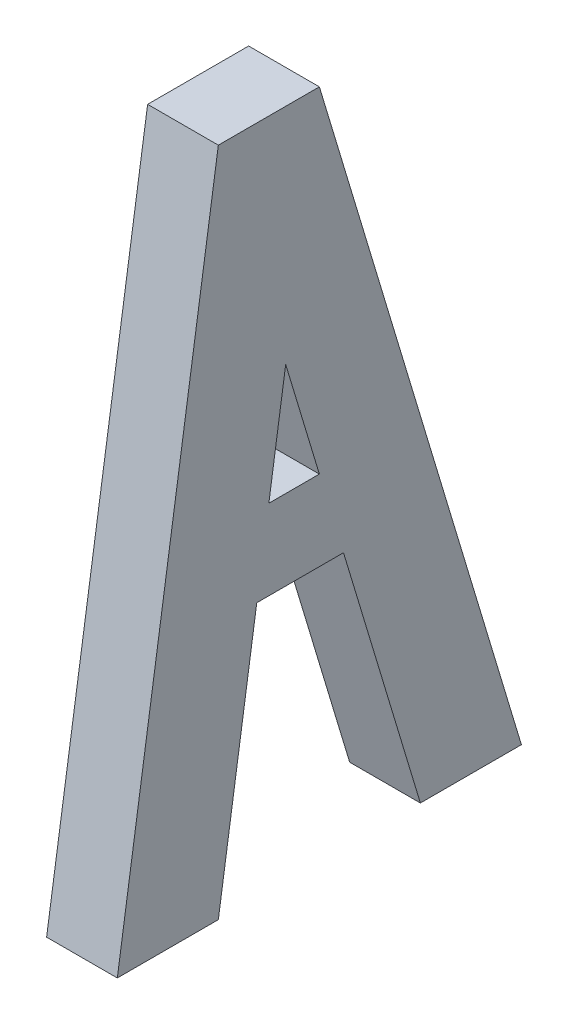
ISO-10303-21;
HEADER;
FILE_DESCRIPTION(('STEP AP214'),'2;1');
FILE_NAME('part.step','',(''),(''),'','','');
FILE_SCHEMA(('AUTOMOTIVE_DESIGN { 1 0 10303 214 1 1 1 1 }'));
ENDSEC;
DATA;
#1=APPLICATION_CONTEXT('core data for automotive mechanical design processes');
#2=APPLICATION_PROTOCOL_DEFINITION('international standard','automotive_design',2000,#1);
#3=PRODUCT_CONTEXT('',#1,'mechanical');
#4=PRODUCT('Part','Part','',(#3));
#5=PRODUCT_RELATED_PRODUCT_CATEGORY('part','',(#4));
#6=PRODUCT_DEFINITION_FORMATION('','',#4);
#7=PRODUCT_DEFINITION_CONTEXT('part definition',#1,'design');
#8=PRODUCT_DEFINITION('design','',#6,#7);
#9=PRODUCT_DEFINITION_SHAPE('','',#8);
#10=(LENGTH_UNIT() NAMED_UNIT(*) SI_UNIT(.MILLI.,.METRE.));
#11=(NAMED_UNIT(*) PLANE_ANGLE_UNIT() SI_UNIT($,.RADIAN.));
#12=(NAMED_UNIT(*) SI_UNIT($,.STERADIAN.) SOLID_ANGLE_UNIT());
#13=UNCERTAINTY_MEASURE_WITH_UNIT(LENGTH_MEASURE(1.E-05),#10,'distance_accuracy_value','');
#14=(GEOMETRIC_REPRESENTATION_CONTEXT(3) GLOBAL_UNCERTAINTY_ASSIGNED_CONTEXT((#13)) GLOBAL_UNIT_ASSIGNED_CONTEXT((#10,
#11,#12)) REPRESENTATION_CONTEXT('',''));
#15=CARTESIAN_POINT('',(0.,0.,0.));
#16=DIRECTION('',(0.,0.,1.));
#17=DIRECTION('',(1.,0.,0.));
#18=AXIS2_PLACEMENT_3D('',#15,#16,#17);
#19=CARTESIAN_POINT('',(35.,-80.6247450304595,0.));
#20=DIRECTION('',(0.,-1.,0.));
#21=DIRECTION('',(0.,0.,-1.));
#22=AXIS2_PLACEMENT_3D('',#19,#20,#21);
#23=PLANE('',#22);
#24=DIRECTION('',(0.,0.,1.));
#25=VECTOR('',#24,1.);
#26=CARTESIAN_POINT('',(0.,-80.6247450304595,0.));
#27=LINE('',#26,#25);
#28=CARTESIAN_POINT('',(0.,-80.6247450304596,73.8009802094741));
#29=VERTEX_POINT('',#28);
#30=CARTESIAN_POINT('',(0.,-80.6247450304596,123.800980209474));
#31=VERTEX_POINT('',#30);
#32=EDGE_CURVE('E161',#29,#31,#27,.T.);
#33=ORIENTED_EDGE('',*,*,#32,.F.);
#34=DIRECTION('',(-1.,0.,0.));
#35=VECTOR('',#34,1.);
#36=CARTESIAN_POINT('',(35.,-80.6247450304596,73.8009802094741));
#37=LINE('',#36,#35);
#38=CARTESIAN_POINT('',(35.,-80.6247450304596,73.8009802094741));
#39=VERTEX_POINT('',#38);
#40=EDGE_CURVE('E11',#39,#29,#37,.T.);
#41=ORIENTED_EDGE('',*,*,#40,.F.);
#42=DIRECTION('',(0.,0.,1.));
#43=VECTOR('',#42,1.);
#44=CARTESIAN_POINT('',(35.,-80.6247450304595,0.));
#45=LINE('',#44,#43);
#46=CARTESIAN_POINT('',(35.,-80.6247450304596,123.800980209474));
#47=VERTEX_POINT('',#46);
#48=EDGE_CURVE('E226',#39,#47,#45,.T.);
#49=ORIENTED_EDGE('',*,*,#48,.T.);
#50=DIRECTION('',(-1.,0.,0.));
#51=VECTOR('',#50,1.);
#52=CARTESIAN_POINT('',(35.,-80.6247450304596,123.800980209474));
#53=LINE('',#52,#51);
#54=EDGE_CURVE('E52',#47,#31,#53,.T.);
#55=ORIENTED_EDGE('',*,*,#54,.T.);
#56=EDGE_LOOP('',(#33,#41,#49,#55));
#57=FACE_BOUND('',#56,.T.);
#58=ADVANCED_FACE('F33',(#57),#23,.T.);
#59=CARTESIAN_POINT('',(35.,9.08021184583275,60.2907906139603));
#60=DIRECTION('',(0.,0.14892739737459,0.988848133087802));
#61=DIRECTION('',(0.,-0.988848133087802,0.14892739737459));
#62=AXIS2_PLACEMENT_3D('',#59,#60,#61);
#63=PLANE('',#62);
#64=DIRECTION('',(0.,0.988848133087802,-0.14892739737459));
#65=VECTOR('',#64,1.);
#66=CARTESIAN_POINT('',(0.,9.08021184583275,60.2907906139603));
#67=LINE('',#66,#65);
#68=CARTESIAN_POINT('',(0.,45.7003918355954,54.775537144012));
#69=VERTEX_POINT('',#68);
#70=EDGE_CURVE('E162',#29,#69,#67,.T.);
#71=ORIENTED_EDGE('',*,*,#70,.T.);
#72=DIRECTION('',(-1.,0.,0.));
#73=VECTOR('',#72,1.);
#74=CARTESIAN_POINT('',(35.,45.7003918355954,54.775537144012));
#75=LINE('',#74,#73);
#76=CARTESIAN_POINT('',(35.,45.7003918355954,54.775537144012));
#77=VERTEX_POINT('',#76);
#78=EDGE_CURVE('E43',#77,#69,#75,.T.);
#79=ORIENTED_EDGE('',*,*,#78,.F.);
#80=DIRECTION('',(0.,0.988848133087802,-0.14892739737459));
#81=VECTOR('',#80,1.);
#82=CARTESIAN_POINT('',(35.,9.08021184583275,60.2907906139603));
#83=LINE('',#82,#81);
#84=EDGE_CURVE('E224',#39,#77,#83,.T.);
#85=ORIENTED_EDGE('',*,*,#84,.F.);
#86=ORIENTED_EDGE('',*,*,#40,.T.);
#87=EDGE_LOOP('',(#71,#79,#85,#86));
#88=FACE_BOUND('',#87,.T.);
#89=ADVANCED_FACE('F205',(#88),#63,.F.);
#90=CARTESIAN_POINT('',(35.,45.7003918355954,0.));
#91=DIRECTION('',(0.,1.,0.));
#92=DIRECTION('',(0.,0.,1.));
#93=AXIS2_PLACEMENT_3D('',#90,#91,#92);
#94=PLANE('',#93);
#95=DIRECTION('',(0.,0.,-1.));
#96=VECTOR('',#95,1.);
#97=CARTESIAN_POINT('',(0.,45.7003918355954,0.));
#98=LINE('',#97,#96);
#99=CARTESIAN_POINT('',(0.,45.7003918355954,11.8518663403982));
#100=VERTEX_POINT('',#99);
#101=EDGE_CURVE('E164',#69,#100,#98,.T.);
#102=ORIENTED_EDGE('',*,*,#101,.T.);
#103=DIRECTION('',(-1.,0.,0.));
#104=VECTOR('',#103,1.);
#105=CARTESIAN_POINT('',(35.,45.7003918355954,11.8518663403982));
#106=LINE('',#105,#104);
#107=CARTESIAN_POINT('',(35.,45.7003918355954,11.8518663403982));
#108=VERTEX_POINT('',#107);
#109=EDGE_CURVE('E182',#108,#100,#106,.T.);
#110=ORIENTED_EDGE('',*,*,#109,.F.);
#111=DIRECTION('',(0.,0.,-1.));
#112=VECTOR('',#111,1.);
#113=CARTESIAN_POINT('',(35.,45.7003918355954,0.));
#114=LINE('',#113,#112);
#115=EDGE_CURVE('E225',#77,#108,#114,.T.);
#116=ORIENTED_EDGE('',*,*,#115,.F.);
#117=ORIENTED_EDGE('',*,*,#78,.T.);
#118=EDGE_LOOP('',(#102,#110,#116,#117));
#119=FACE_BOUND('',#118,.T.);
#120=ADVANCED_FACE('F213',(#119),#94,.F.);
#121=CARTESIAN_POINT('',(35.,0.528491123646574,-1.75453768139426));
#122=DIRECTION('',(0.,-0.28841404566362,0.957505790198651));
#123=DIRECTION('',(0.,-0.957505790198651,-0.28841404566362));
#124=AXIS2_PLACEMENT_3D('',#121,#122,#123);
#125=PLANE('',#124);
#126=DIRECTION('',(0.,0.957505790198651,0.28841404566362));
#127=VECTOR('',#126,1.);
#128=CARTESIAN_POINT('',(0.,0.528491123646574,-1.75453768139426));
#129=LINE('',#128,#127);
#130=CARTESIAN_POINT('',(0.,-80.6247450304596,-26.1990197905259));
#131=VERTEX_POINT('',#130);
#132=EDGE_CURVE('E156',#131,#100,#129,.T.);
#133=ORIENTED_EDGE('',*,*,#132,.F.);
#134=DIRECTION('',(-1.,0.,0.));
#135=VECTOR('',#134,1.);
#136=CARTESIAN_POINT('',(35.,-80.6247450304596,-26.1990197905259));
#137=LINE('',#136,#135);
#138=CARTESIAN_POINT('',(35.,-80.6247450304596,-26.1990197905259));
#139=VERTEX_POINT('',#138);
#140=EDGE_CURVE('E180',#139,#131,#137,.T.);
#141=ORIENTED_EDGE('',*,*,#140,.F.);
#142=DIRECTION('',(0.,0.957505790198651,0.28841404566362));
#143=VECTOR('',#142,1.);
#144=CARTESIAN_POINT('',(35.,0.528491123646574,-1.75453768139426));
#145=LINE('',#144,#143);
#146=EDGE_CURVE('E232',#139,#108,#145,.T.);
#147=ORIENTED_EDGE('',*,*,#146,.T.);
#148=ORIENTED_EDGE('',*,*,#109,.T.);
#149=EDGE_LOOP('',(#133,#141,#147,#148));
#150=FACE_BOUND('',#149,.T.);
#151=ADVANCED_FACE('F252',(#150),#125,.T.);
#152=CARTESIAN_POINT('',(35.,-80.6247450304596,0.));
#153=DIRECTION('',(0.,-1.,0.));
#154=DIRECTION('',(0.,0.,-1.));
#155=AXIS2_PLACEMENT_3D('',#152,#153,#154);
#156=PLANE('',#155);
#157=DIRECTION('',(0.,0.,1.));
#158=VECTOR('',#157,1.);
#159=CARTESIAN_POINT('',(0.,-80.6247450304596,0.));
#160=LINE('',#159,#158);
#161=CARTESIAN_POINT('',(0.,-80.6247450304596,-76.1990197905259));
#162=VERTEX_POINT('',#161);
#163=EDGE_CURVE('E167',#162,#131,#160,.T.);
#164=ORIENTED_EDGE('',*,*,#163,.F.);
#165=DIRECTION('',(-1.,0.,0.));
#166=VECTOR('',#165,1.);
#167=CARTESIAN_POINT('',(35.,-80.6247450304596,-76.1990197905259));
#168=LINE('',#167,#166);
#169=CARTESIAN_POINT('',(35.,-80.6247450304596,-76.1990197905259));
#170=VERTEX_POINT('',#169);
#171=EDGE_CURVE('E132',#170,#162,#168,.T.);
#172=ORIENTED_EDGE('',*,*,#171,.F.);
#173=DIRECTION('',(0.,0.,1.));
#174=VECTOR('',#173,1.);
#175=CARTESIAN_POINT('',(35.,-80.6247450304596,0.));
#176=LINE('',#175,#174);
#177=EDGE_CURVE('E143',#170,#139,#176,.T.);
#178=ORIENTED_EDGE('',*,*,#177,.T.);
#179=ORIENTED_EDGE('',*,*,#140,.T.);
#180=EDGE_LOOP('',(#164,#172,#178,#179));
#181=FACE_BOUND('',#180,.T.);
#182=ADVANCED_FACE('F249',(#181),#156,.T.);
#183=CARTESIAN_POINT('',(35.,14.3363970585233,-47.5954045945915));
#184=DIRECTION('',(0.,0.28841404566362,-0.957505790198651));
#185=DIRECTION('',(0.,0.957505790198651,0.28841404566362));
#186=AXIS2_PLACEMENT_3D('',#183,#184,#185);
#187=PLANE('',#186);
#188=DIRECTION('',(0.,-0.957505790198651,-0.28841404566362));
#189=VECTOR('',#188,1.);
#190=CARTESIAN_POINT('',(0.,14.3363970585233,-47.5954045945915));
#191=LINE('',#190,#189);
#192=CARTESIAN_POINT('',(0.,251.36525496954,23.8009802094741));
#193=VERTEX_POINT('',#192);
#194=EDGE_CURVE('E128',#193,#162,#191,.T.);
#195=ORIENTED_EDGE('',*,*,#194,.F.);
#196=DIRECTION('',(-1.,0.,0.));
#197=VECTOR('',#196,1.);
#198=CARTESIAN_POINT('',(35.,251.36525496954,23.8009802094741));
#199=LINE('',#198,#197);
#200=CARTESIAN_POINT('',(35.,251.36525496954,23.8009802094741));
#201=VERTEX_POINT('',#200);
#202=EDGE_CURVE('E123',#201,#193,#199,.T.);
#203=ORIENTED_EDGE('',*,*,#202,.F.);
#204=DIRECTION('',(0.,-0.957505790198651,-0.28841404566362));
#205=VECTOR('',#204,1.);
#206=CARTESIAN_POINT('',(35.,14.3363970585233,-47.5954045945915));
#207=LINE('',#206,#205);
#208=EDGE_CURVE('E126',#201,#170,#207,.T.);
#209=ORIENTED_EDGE('',*,*,#208,.T.);
#210=ORIENTED_EDGE('',*,*,#171,.T.);
#211=EDGE_LOOP('',(#195,#203,#209,#210));
#212=FACE_BOUND('',#211,.T.);
#213=ADVANCED_FACE('F125',(#212),#187,.T.);
#214=CARTESIAN_POINT('',(35.,251.36525496954,0.));
#215=DIRECTION('',(0.,1.,0.));
#216=DIRECTION('',(0.,0.,1.));
#217=AXIS2_PLACEMENT_3D('',#214,#215,#216);
#218=PLANE('',#217);
#219=DIRECTION('',(0.,0.,-1.));
#220=VECTOR('',#219,1.);
#221=CARTESIAN_POINT('',(0.,251.36525496954,0.));
#222=LINE('',#221,#220);
#223=CARTESIAN_POINT('',(0.,251.36525496954,73.8009802094741));
#224=VERTEX_POINT('',#223);
#225=EDGE_CURVE('E171',#224,#193,#222,.T.);
#226=ORIENTED_EDGE('',*,*,#225,.F.);
#227=DIRECTION('',(-1.,0.,0.));
#228=VECTOR('',#227,1.);
#229=CARTESIAN_POINT('',(35.,251.36525496954,73.8009802094741));
#230=LINE('',#229,#228);
#231=CARTESIAN_POINT('',(35.,251.36525496954,73.8009802094741));
#232=VERTEX_POINT('',#231);
#233=EDGE_CURVE('E86',#232,#224,#230,.T.);
#234=ORIENTED_EDGE('',*,*,#233,.F.);
#235=DIRECTION('',(0.,0.,-1.));
#236=VECTOR('',#235,1.);
#237=CARTESIAN_POINT('',(35.,251.36525496954,0.));
#238=LINE('',#237,#236);
#239=EDGE_CURVE('E140',#232,#201,#238,.T.);
#240=ORIENTED_EDGE('',*,*,#239,.T.);
#241=ORIENTED_EDGE('',*,*,#202,.T.);
#242=EDGE_LOOP('',(#226,#234,#240,#241));
#243=FACE_BOUND('',#242,.T.);
#244=ADVANCED_FACE('F145',(#243),#218,.T.);
#245=CARTESIAN_POINT('',(0.,85.3702549695404,23.8009802094741));
#246=VERTEX_POINT('',#245);
#247=CARTESIAN_POINT('',(0.,140.701921636207,40.4676468761408));
#248=VERTEX_POINT('',#247);
#249=EDGE_CURVE('E152',#246,#248,#129,.T.);
#250=ORIENTED_EDGE('',*,*,#249,.F.);
#251=DIRECTION('',(-1.,0.,0.));
#252=VECTOR('',#251,1.);
#253=CARTESIAN_POINT('',(35.,85.3702549695404,23.8009802094741));
#254=LINE('',#253,#252);
#255=CARTESIAN_POINT('',(35.,85.3702549695404,23.8009802094741));
#256=VERTEX_POINT('',#255);
#257=EDGE_CURVE('E37',#256,#246,#254,.T.);
#258=ORIENTED_EDGE('',*,*,#257,.F.);
#259=CARTESIAN_POINT('',(35.,140.701921636207,40.4676468761408));
#260=VERTEX_POINT('',#259);
#261=EDGE_CURVE('E176',#256,#260,#145,.T.);
#262=ORIENTED_EDGE('',*,*,#261,.T.);
#263=DIRECTION('',(-1.,0.,0.));
#264=VECTOR('',#263,1.);
#265=CARTESIAN_POINT('',(35.,140.701921636207,40.4676468761408));
#266=LINE('',#265,#264);
#267=EDGE_CURVE('E148',#260,#248,#266,.T.);
#268=ORIENTED_EDGE('',*,*,#267,.T.);
#269=EDGE_LOOP('',(#250,#258,#262,#268));
#270=FACE_BOUND('',#269,.T.);
#271=ADVANCED_FACE('F199',(#270),#125,.T.);
#272=CARTESIAN_POINT('',(35.,85.3702549695404,0.));
#273=DIRECTION('',(0.,-1.,0.));
#274=DIRECTION('',(0.,0.,-1.));
#275=AXIS2_PLACEMENT_3D('',#272,#273,#274);
#276=PLANE('',#275);
#277=DIRECTION('',(0.,0.,1.));
#278=VECTOR('',#277,1.);
#279=CARTESIAN_POINT('',(0.,85.3702549695404,0.));
#280=LINE('',#279,#278);
#281=CARTESIAN_POINT('',(0.,85.3702549695405,48.8009802094741));
#282=VERTEX_POINT('',#281);
#283=EDGE_CURVE('E155',#246,#282,#280,.T.);
#284=ORIENTED_EDGE('',*,*,#283,.T.);
#285=DIRECTION('',(-1.,0.,0.));
#286=VECTOR('',#285,1.);
#287=CARTESIAN_POINT('',(35.,85.3702549695405,48.8009802094741));
#288=LINE('',#287,#286);
#289=CARTESIAN_POINT('',(35.,85.3702549695405,48.8009802094741));
#290=VERTEX_POINT('',#289);
#291=EDGE_CURVE('E186',#290,#282,#288,.T.);
#292=ORIENTED_EDGE('',*,*,#291,.F.);
#293=DIRECTION('',(0.,0.,1.));
#294=VECTOR('',#293,1.);
#295=CARTESIAN_POINT('',(35.,85.3702549695404,0.));
#296=LINE('',#295,#294);
#297=EDGE_CURVE('E194',#256,#290,#296,.T.);
#298=ORIENTED_EDGE('',*,*,#297,.F.);
#299=ORIENTED_EDGE('',*,*,#257,.T.);
#300=EDGE_LOOP('',(#284,#292,#298,#299));
#301=FACE_BOUND('',#300,.T.);
#302=ADVANCED_FACE('F35',(#301),#276,.F.);
#303=EDGE_CURVE('E158',#282,#248,#67,.T.);
#304=ORIENTED_EDGE('',*,*,#303,.T.);
#305=ORIENTED_EDGE('',*,*,#267,.F.);
#306=EDGE_CURVE('E228',#290,#260,#83,.T.);
#307=ORIENTED_EDGE('',*,*,#306,.F.);
#308=ORIENTED_EDGE('',*,*,#291,.T.);
#309=EDGE_LOOP('',(#304,#305,#307,#308));
#310=FACE_BOUND('',#309,.T.);
#311=ADVANCED_FACE('F201',(#310),#63,.F.);
#312=CARTESIAN_POINT('',(35.,16.4435407888072,109.181822129522));
#313=DIRECTION('',(0.,0.14892739737459,0.988848133087802));
#314=DIRECTION('',(0.,-0.988848133087802,0.14892739737459));
#315=AXIS2_PLACEMENT_3D('',#312,#313,#314);
#316=PLANE('',#315);
#317=DIRECTION('',(0.,0.988848133087802,-0.14892739737459));
#318=VECTOR('',#317,1.);
#319=CARTESIAN_POINT('',(0.,16.4435407888072,109.181822129522));
#320=LINE('',#319,#318);
#321=EDGE_CURVE('E173',#31,#224,#320,.T.);
#322=ORIENTED_EDGE('',*,*,#321,.F.);
#323=ORIENTED_EDGE('',*,*,#54,.F.);
#324=DIRECTION('',(0.,0.988848133087802,-0.14892739737459));
#325=VECTOR('',#324,1.);
#326=CARTESIAN_POINT('',(35.,16.4435407888072,109.181822129522));
#327=LINE('',#326,#325);
#328=EDGE_CURVE('E146',#47,#232,#327,.T.);
#329=ORIENTED_EDGE('',*,*,#328,.T.);
#330=ORIENTED_EDGE('',*,*,#233,.T.);
#331=EDGE_LOOP('',(#322,#323,#329,#330));
#332=FACE_BOUND('',#331,.T.);
#333=ADVANCED_FACE('F203',(#332),#316,.T.);
#334=CARTESIAN_POINT('',(35.,0.,0.));
#335=DIRECTION('',(1.,0.,0.));
#336=DIRECTION('',(0.,0.,-1.));
#337=AXIS2_PLACEMENT_3D('',#334,#335,#336);
#338=PLANE('',#337);
#339=ORIENTED_EDGE('',*,*,#261,.F.);
#340=ORIENTED_EDGE('',*,*,#297,.T.);
#341=ORIENTED_EDGE('',*,*,#306,.T.);
#342=EDGE_LOOP('',(#339,#340,#341));
#343=FACE_BOUND('',#342,.T.);
#344=ORIENTED_EDGE('',*,*,#48,.F.);
#345=ORIENTED_EDGE('',*,*,#84,.T.);
#346=ORIENTED_EDGE('',*,*,#115,.T.);
#347=ORIENTED_EDGE('',*,*,#146,.F.);
#348=ORIENTED_EDGE('',*,*,#177,.F.);
#349=ORIENTED_EDGE('',*,*,#208,.F.);
#350=ORIENTED_EDGE('',*,*,#239,.F.);
#351=ORIENTED_EDGE('',*,*,#328,.F.);
#352=EDGE_LOOP('',(#344,#345,#346,#347,#348,#349,#350,#351));
#353=FACE_BOUND('',#352,.T.);
#354=ADVANCED_FACE('F138',(#343,#353),#338,.T.);
#355=CARTESIAN_POINT('',(0.,0.,0.));
#356=DIRECTION('',(1.,0.,0.));
#357=DIRECTION('',(0.,0.,-1.));
#358=AXIS2_PLACEMENT_3D('',#355,#356,#357);
#359=PLANE('',#358);
#360=ORIENTED_EDGE('',*,*,#249,.T.);
#361=ORIENTED_EDGE('',*,*,#303,.F.);
#362=ORIENTED_EDGE('',*,*,#283,.F.);
#363=EDGE_LOOP('',(#360,#361,#362));
#364=FACE_BOUND('',#363,.T.);
#365=ORIENTED_EDGE('',*,*,#32,.T.);
#366=ORIENTED_EDGE('',*,*,#321,.T.);
#367=ORIENTED_EDGE('',*,*,#225,.T.);
#368=ORIENTED_EDGE('',*,*,#194,.T.);
#369=ORIENTED_EDGE('',*,*,#163,.T.);
#370=ORIENTED_EDGE('',*,*,#132,.T.);
#371=ORIENTED_EDGE('',*,*,#101,.F.);
#372=ORIENTED_EDGE('',*,*,#70,.F.);
#373=EDGE_LOOP('',(#365,#366,#367,#368,#369,#370,#371,#372));
#374=FACE_BOUND('',#373,.T.);
#375=ADVANCED_FACE('F197',(#364,#374),#359,.F.);
#376=CLOSED_SHELL('',(#58,#89,#120,#151,#182,#213,#244,#271,#302,#311,#333,#354,#375));
#377=MANIFOLD_SOLID_BREP('B2',#376);
#378=ADVANCED_BREP_SHAPE_REPRESENTATION('',(#18,#377),#14);
#379=SHAPE_DEFINITION_REPRESENTATION(#9,#378);
ENDSEC;
END-ISO-10303-21;
